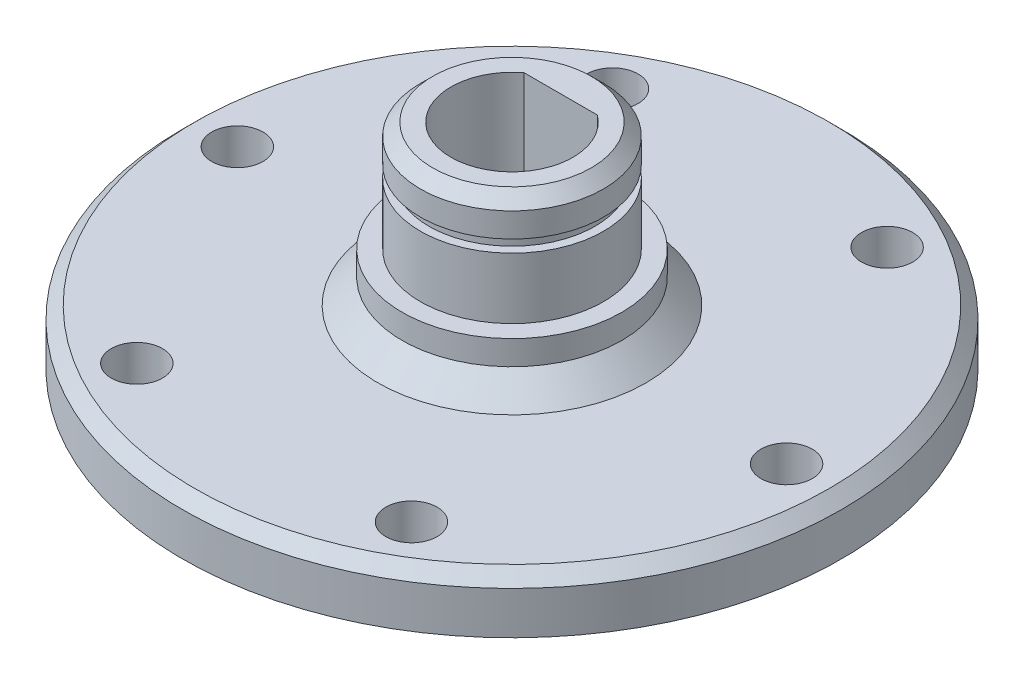
ISO-10303-21;
HEADER;
FILE_DESCRIPTION(('STEP AP214'),'2;1');
FILE_NAME('part.step','',(''),(''),'','','');
FILE_SCHEMA(('AUTOMOTIVE_DESIGN { 1 0 10303 214 1 1 1 1 }'));
ENDSEC;
DATA;
#1=APPLICATION_CONTEXT('core data for automotive mechanical design processes');
#2=APPLICATION_PROTOCOL_DEFINITION('international standard','automotive_design',2000,#1);
#3=PRODUCT_CONTEXT('',#1,'mechanical');
#4=PRODUCT('Part','Part','',(#3));
#5=PRODUCT_RELATED_PRODUCT_CATEGORY('part','',(#4));
#6=PRODUCT_DEFINITION_FORMATION('','',#4);
#7=PRODUCT_DEFINITION_CONTEXT('part definition',#1,'design');
#8=PRODUCT_DEFINITION('design','',#6,#7);
#9=PRODUCT_DEFINITION_SHAPE('','',#8);
#10=(LENGTH_UNIT() NAMED_UNIT(*) SI_UNIT(.MILLI.,.METRE.));
#11=(NAMED_UNIT(*) PLANE_ANGLE_UNIT() SI_UNIT($,.RADIAN.));
#12=(NAMED_UNIT(*) SI_UNIT($,.STERADIAN.) SOLID_ANGLE_UNIT());
#13=UNCERTAINTY_MEASURE_WITH_UNIT(LENGTH_MEASURE(1.E-05),#10,'distance_accuracy_value','');
#14=(GEOMETRIC_REPRESENTATION_CONTEXT(3) GLOBAL_UNCERTAINTY_ASSIGNED_CONTEXT((#13)) GLOBAL_UNIT_ASSIGNED_CONTEXT((#10,
#11,#12)) REPRESENTATION_CONTEXT('',''));
#15=CARTESIAN_POINT('',(0.,0.,0.));
#16=DIRECTION('',(0.,0.,1.));
#17=DIRECTION('',(1.,0.,0.));
#18=AXIS2_PLACEMENT_3D('',#15,#16,#17);
#19=CARTESIAN_POINT('',(7.5,19.,0.));
#20=DIRECTION('',(0.,-1.,0.));
#21=DIRECTION('',(1.,0.,0.));
#22=AXIS2_PLACEMENT_3D('',#19,#20,#21);
#23=PLANE('',#22);
#24=CARTESIAN_POINT('',(0.,19.,0.));
#25=DIRECTION('',(0.,-1.,0.));
#26=DIRECTION('',(1.,0.,0.));
#27=AXIS2_PLACEMENT_3D('',#24,#25,#26);
#28=CIRCLE('',#27,6.50000000000001);
#29=CARTESIAN_POINT('',(6.50000000000001,19.,0.));
#30=VERTEX_POINT('',#29);
#31=EDGE_CURVE('E50',#30,#30,#28,.F.);
#32=ORIENTED_EDGE('',*,*,#31,.T.);
#33=EDGE_LOOP('',(#32));
#34=FACE_BOUND('',#33,.T.);
#35=DIRECTION('',(-1.,0.,0.));
#36=VECTOR('',#35,1.);
#37=CARTESIAN_POINT('',(-3.,19.,-4.));
#38=LINE('',#37,#36);
#39=CARTESIAN_POINT('',(3.,19.,-4.));
#40=VERTEX_POINT('',#39);
#41=CARTESIAN_POINT('',(-3.,19.,-4.));
#42=VERTEX_POINT('',#41);
#43=EDGE_CURVE('E78',#40,#42,#38,.T.);
#44=ORIENTED_EDGE('',*,*,#43,.F.);
#45=CARTESIAN_POINT('',(0.,19.,0.));
#46=DIRECTION('',(0.,1.,0.));
#47=DIRECTION('',(-1.,0.,0.));
#48=AXIS2_PLACEMENT_3D('',#45,#46,#47);
#49=CIRCLE('',#48,5.);
#50=EDGE_CURVE('E57',#42,#40,#49,.T.);
#51=ORIENTED_EDGE('',*,*,#50,.F.);
#52=EDGE_LOOP('',(#44,#51));
#53=FACE_BOUND('',#52,.T.);
#54=ADVANCED_FACE('F41',(#34,#53),#23,.F.);
#55=CARTESIAN_POINT('',(10.,0.,0.));
#56=DIRECTION('',(0.,1.,0.));
#57=DIRECTION('',(-1.,0.,0.));
#58=AXIS2_PLACEMENT_3D('',#55,#56,#57);
#59=PLANE('',#58);
#60=DIRECTION('',(-1.,0.,0.));
#61=VECTOR('',#60,1.);
#62=CARTESIAN_POINT('',(-3.,0.,-4.));
#63=LINE('',#62,#61);
#64=CARTESIAN_POINT('',(3.,0.,-4.));
#65=VERTEX_POINT('',#64);
#66=CARTESIAN_POINT('',(-3.,0.,-4.));
#67=VERTEX_POINT('',#66);
#68=EDGE_CURVE('E91',#65,#67,#63,.T.);
#69=ORIENTED_EDGE('',*,*,#68,.T.);
#70=CARTESIAN_POINT('',(0.,0.,0.));
#71=DIRECTION('',(0.,1.,0.));
#72=DIRECTION('',(-1.,0.,0.));
#73=AXIS2_PLACEMENT_3D('',#70,#71,#72);
#74=CIRCLE('',#73,5.);
#75=EDGE_CURVE('E62',#67,#65,#74,.T.);
#76=ORIENTED_EDGE('',*,*,#75,.T.);
#77=EDGE_LOOP('',(#69,#76));
#78=FACE_BOUND('',#77,.T.);
#79=CARTESIAN_POINT('',(0.,0.,0.));
#80=DIRECTION('',(0.,1.,0.));
#81=DIRECTION('',(-1.,0.,0.));
#82=AXIS2_PLACEMENT_3D('',#79,#80,#81);
#83=CIRCLE('',#82,10.);
#84=CARTESIAN_POINT('',(-10.,0.,0.));
#85=VERTEX_POINT('',#84);
#86=EDGE_CURVE('E127',#85,#85,#83,.T.);
#87=ORIENTED_EDGE('',*,*,#86,.F.);
#88=EDGE_LOOP('',(#87));
#89=FACE_BOUND('',#88,.T.);
#90=ADVANCED_FACE('F161',(#78,#89),#59,.F.);
#91=CARTESIAN_POINT('',(0.,19.,0.));
#92=DIRECTION('',(0.,1.,0.));
#93=DIRECTION('',(-1.,0.,0.));
#94=AXIS2_PLACEMENT_3D('',#91,#92,#93);
#95=CYLINDRICAL_SURFACE('',#94,10.);
#96=CARTESIAN_POINT('',(0.,1.5,0.));
#97=DIRECTION('',(0.,1.,0.));
#98=DIRECTION('',(-1.,0.,0.));
#99=AXIS2_PLACEMENT_3D('',#96,#97,#98);
#100=CIRCLE('',#99,10.);
#101=CARTESIAN_POINT('',(-10.,1.5,0.));
#102=VERTEX_POINT('',#101);
#103=EDGE_CURVE('E123',#102,#102,#100,.T.);
#104=ORIENTED_EDGE('',*,*,#103,.F.);
#105=EDGE_LOOP('',(#104));
#106=FACE_BOUND('',#105,.T.);
#107=ORIENTED_EDGE('',*,*,#86,.T.);
#108=EDGE_LOOP('',(#107));
#109=FACE_BOUND('',#108,.T.);
#110=ADVANCED_FACE('F166',(#106,#109),#95,.T.);
#111=CARTESIAN_POINT('',(10.,1.5,0.));
#112=DIRECTION('',(0.,1.,0.));
#113=DIRECTION('',(-1.,0.,0.));
#114=AXIS2_PLACEMENT_3D('',#111,#112,#113);
#115=PLANE('',#114);
#116=CARTESIAN_POINT('',(-11.25,1.5,-19.4855715851499));
#117=DIRECTION('',(0.,1.,0.));
#118=DIRECTION('',(-1.,0.,0.));
#119=AXIS2_PLACEMENT_3D('',#116,#117,#118);
#120=CIRCLE('',#119,2.1);
#121=CARTESIAN_POINT('',(-13.35,1.5,-19.4855715851499));
#122=VERTEX_POINT('',#121);
#123=EDGE_CURVE('E432',#122,#122,#120,.T.);
#124=ORIENTED_EDGE('',*,*,#123,.T.);
#125=EDGE_LOOP('',(#124));
#126=FACE_BOUND('',#125,.T.);
#127=CARTESIAN_POINT('',(11.25,1.5,-19.4855715851499));
#128=DIRECTION('',(0.,1.,0.));
#129=DIRECTION('',(-1.,0.,0.));
#130=AXIS2_PLACEMENT_3D('',#127,#128,#129);
#131=CIRCLE('',#130,2.1);
#132=CARTESIAN_POINT('',(9.15,1.5,-19.4855715851499));
#133=VERTEX_POINT('',#132);
#134=EDGE_CURVE('E422',#133,#133,#131,.T.);
#135=ORIENTED_EDGE('',*,*,#134,.T.);
#136=EDGE_LOOP('',(#135));
#137=FACE_BOUND('',#136,.T.);
#138=CARTESIAN_POINT('',(22.5,1.5,0.));
#139=DIRECTION('',(0.,1.,0.));
#140=DIRECTION('',(-1.,0.,0.));
#141=AXIS2_PLACEMENT_3D('',#138,#139,#140);
#142=CIRCLE('',#141,2.1);
#143=CARTESIAN_POINT('',(20.4,1.5,0.));
#144=VERTEX_POINT('',#143);
#145=EDGE_CURVE('E430',#144,#144,#142,.T.);
#146=ORIENTED_EDGE('',*,*,#145,.T.);
#147=EDGE_LOOP('',(#146));
#148=FACE_BOUND('',#147,.T.);
#149=CARTESIAN_POINT('',(11.25,1.5,19.4855715851499));
#150=DIRECTION('',(0.,1.,0.));
#151=DIRECTION('',(-1.,0.,0.));
#152=AXIS2_PLACEMENT_3D('',#149,#150,#151);
#153=CIRCLE('',#152,2.1);
#154=CARTESIAN_POINT('',(9.15,1.5,19.4855715851499));
#155=VERTEX_POINT('',#154);
#156=EDGE_CURVE('E443',#155,#155,#153,.T.);
#157=ORIENTED_EDGE('',*,*,#156,.T.);
#158=EDGE_LOOP('',(#157));
#159=FACE_BOUND('',#158,.T.);
#160=CARTESIAN_POINT('',(-11.25,1.5,19.4855715851499));
#161=DIRECTION('',(0.,1.,0.));
#162=DIRECTION('',(-1.,0.,0.));
#163=AXIS2_PLACEMENT_3D('',#160,#161,#162);
#164=CIRCLE('',#163,2.1);
#165=CARTESIAN_POINT('',(-13.35,1.5,19.4855715851499));
#166=VERTEX_POINT('',#165);
#167=EDGE_CURVE('E451',#166,#166,#164,.T.);
#168=ORIENTED_EDGE('',*,*,#167,.T.);
#169=EDGE_LOOP('',(#168));
#170=FACE_BOUND('',#169,.T.);
#171=CARTESIAN_POINT('',(-22.5,1.5,0.));
#172=DIRECTION('',(0.,1.,0.));
#173=DIRECTION('',(-1.,0.,0.));
#174=AXIS2_PLACEMENT_3D('',#171,#172,#173);
#175=CIRCLE('',#174,2.1);
#176=CARTESIAN_POINT('',(-24.6,1.5,0.));
#177=VERTEX_POINT('',#176);
#178=EDGE_CURVE('E84',#177,#177,#175,.T.);
#179=ORIENTED_EDGE('',*,*,#178,.T.);
#180=EDGE_LOOP('',(#179));
#181=FACE_BOUND('',#180,.T.);
#182=CARTESIAN_POINT('',(0.,1.5,0.));
#183=DIRECTION('',(0.,1.,0.));
#184=DIRECTION('',(-1.,0.,0.));
#185=AXIS2_PLACEMENT_3D('',#182,#183,#184);
#186=CIRCLE('',#185,27.);
#187=CARTESIAN_POINT('',(-27.,1.5,0.));
#188=VERTEX_POINT('',#187);
#189=EDGE_CURVE('E119',#188,#188,#186,.T.);
#190=ORIENTED_EDGE('',*,*,#189,.F.);
#191=EDGE_LOOP('',(#190));
#192=FACE_BOUND('',#191,.T.);
#193=ORIENTED_EDGE('',*,*,#103,.T.);
#194=EDGE_LOOP('',(#193));
#195=FACE_BOUND('',#194,.T.);
#196=ADVANCED_FACE('F211',(#126,#137,#148,#159,#170,#181,#192,#195),#115,.F.);
#197=CARTESIAN_POINT('',(0.,19.,0.));
#198=DIRECTION('',(0.,1.,0.));
#199=DIRECTION('',(-1.,0.,0.));
#200=AXIS2_PLACEMENT_3D('',#197,#198,#199);
#201=CYLINDRICAL_SURFACE('',#200,27.);
#202=CARTESIAN_POINT('',(0.,5.,0.));
#203=DIRECTION('',(0.,-1.,0.));
#204=DIRECTION('',(1.,0.,0.));
#205=AXIS2_PLACEMENT_3D('',#202,#203,#204);
#206=CIRCLE('',#205,27.);
#207=CARTESIAN_POINT('',(27.,5.,0.));
#208=VERTEX_POINT('',#207);
#209=EDGE_CURVE('E143',#208,#208,#206,.T.);
#210=ORIENTED_EDGE('',*,*,#209,.T.);
#211=EDGE_LOOP('',(#210));
#212=FACE_BOUND('',#211,.T.);
#213=ORIENTED_EDGE('',*,*,#189,.T.);
#214=EDGE_LOOP('',(#213));
#215=FACE_BOUND('',#214,.T.);
#216=ADVANCED_FACE('F207',(#212,#215),#201,.T.);
#217=CARTESIAN_POINT('',(27.,6.,0.));
#218=DIRECTION('',(0.,-1.,0.));
#219=DIRECTION('',(1.,0.,0.));
#220=AXIS2_PLACEMENT_3D('',#217,#218,#219);
#221=PLANE('',#220);
#222=CARTESIAN_POINT('',(0.,6.,0.));
#223=DIRECTION('',(0.,-1.,0.));
#224=DIRECTION('',(1.,0.,0.));
#225=AXIS2_PLACEMENT_3D('',#222,#223,#224);
#226=CIRCLE('',#225,26.);
#227=CARTESIAN_POINT('',(26.,6.,0.));
#228=VERTEX_POINT('',#227);
#229=EDGE_CURVE('E139',#228,#228,#226,.F.);
#230=ORIENTED_EDGE('',*,*,#229,.T.);
#231=EDGE_LOOP('',(#230));
#232=FACE_BOUND('',#231,.T.);
#233=CARTESIAN_POINT('',(0.,6.,0.));
#234=DIRECTION('',(0.,-1.,0.));
#235=DIRECTION('',(1.,0.,0.));
#236=AXIS2_PLACEMENT_3D('',#233,#234,#235);
#237=CIRCLE('',#236,11.);
#238=CARTESIAN_POINT('',(11.,6.,0.));
#239=VERTEX_POINT('',#238);
#240=EDGE_CURVE('E135',#239,#239,#237,.T.);
#241=ORIENTED_EDGE('',*,*,#240,.T.);
#242=EDGE_LOOP('',(#241));
#243=FACE_BOUND('',#242,.T.);
#244=CARTESIAN_POINT('',(-11.25,6.,-19.4855715851499));
#245=DIRECTION('',(0.,1.,0.));
#246=DIRECTION('',(0.,0.,1.));
#247=AXIS2_PLACEMENT_3D('',#244,#245,#246);
#248=CIRCLE('',#247,2.1);
#249=CARTESIAN_POINT('',(-11.25,6.,-17.3855715851499));
#250=VERTEX_POINT('',#249);
#251=EDGE_CURVE('E483',#250,#250,#248,.T.);
#252=ORIENTED_EDGE('',*,*,#251,.F.);
#253=EDGE_LOOP('',(#252));
#254=FACE_BOUND('',#253,.T.);
#255=CARTESIAN_POINT('',(11.25,6.,-19.4855715851499));
#256=DIRECTION('',(0.,1.,0.));
#257=DIRECTION('',(0.,0.,1.));
#258=AXIS2_PLACEMENT_3D('',#255,#256,#257);
#259=CIRCLE('',#258,2.1);
#260=CARTESIAN_POINT('',(11.25,6.,-17.3855715851499));
#261=VERTEX_POINT('',#260);
#262=EDGE_CURVE('E419',#261,#261,#259,.T.);
#263=ORIENTED_EDGE('',*,*,#262,.F.);
#264=EDGE_LOOP('',(#263));
#265=FACE_BOUND('',#264,.T.);
#266=CARTESIAN_POINT('',(22.5,6.,0.));
#267=DIRECTION('',(0.,1.,0.));
#268=DIRECTION('',(0.,0.,1.));
#269=AXIS2_PLACEMENT_3D('',#266,#267,#268);
#270=CIRCLE('',#269,2.1);
#271=CARTESIAN_POINT('',(22.5,6.,2.09999999999999));
#272=VERTEX_POINT('',#271);
#273=EDGE_CURVE('E425',#272,#272,#270,.T.);
#274=ORIENTED_EDGE('',*,*,#273,.F.);
#275=EDGE_LOOP('',(#274));
#276=FACE_BOUND('',#275,.T.);
#277=CARTESIAN_POINT('',(11.25,6.,19.4855715851499));
#278=DIRECTION('',(0.,1.,0.));
#279=DIRECTION('',(0.,0.,1.));
#280=AXIS2_PLACEMENT_3D('',#277,#278,#279);
#281=CIRCLE('',#280,2.1);
#282=CARTESIAN_POINT('',(11.25,6.,21.5855715851499));
#283=VERTEX_POINT('',#282);
#284=EDGE_CURVE('E439',#283,#283,#281,.T.);
#285=ORIENTED_EDGE('',*,*,#284,.F.);
#286=EDGE_LOOP('',(#285));
#287=FACE_BOUND('',#286,.T.);
#288=CARTESIAN_POINT('',(-11.25,6.,19.4855715851499));
#289=DIRECTION('',(0.,1.,0.));
#290=DIRECTION('',(0.,0.,1.));
#291=AXIS2_PLACEMENT_3D('',#288,#289,#290);
#292=CIRCLE('',#291,2.1);
#293=CARTESIAN_POINT('',(-11.25,6.,21.5855715851499));
#294=VERTEX_POINT('',#293);
#295=EDGE_CURVE('E447',#294,#294,#292,.T.);
#296=ORIENTED_EDGE('',*,*,#295,.F.);
#297=EDGE_LOOP('',(#296));
#298=FACE_BOUND('',#297,.T.);
#299=CARTESIAN_POINT('',(-22.5,6.,0.));
#300=DIRECTION('',(0.,1.,0.));
#301=DIRECTION('',(0.,0.,1.));
#302=AXIS2_PLACEMENT_3D('',#299,#300,#301);
#303=CIRCLE('',#302,2.1);
#304=CARTESIAN_POINT('',(-22.5,6.,2.1));
#305=VERTEX_POINT('',#304);
#306=EDGE_CURVE('E88',#305,#305,#303,.T.);
#307=ORIENTED_EDGE('',*,*,#306,.F.);
#308=EDGE_LOOP('',(#307));
#309=FACE_BOUND('',#308,.T.);
#310=ADVANCED_FACE('F188',(#232,#243,#254,#265,#276,#287,#298,#309),#221,.F.);
#311=CARTESIAN_POINT('',(0.,19.,0.));
#312=DIRECTION('',(0.,1.,0.));
#313=DIRECTION('',(-1.,0.,0.));
#314=AXIS2_PLACEMENT_3D('',#311,#312,#313);
#315=CYLINDRICAL_SURFACE('',#314,9.);
#316=CARTESIAN_POINT('',(0.,8.,0.));
#317=DIRECTION('',(0.,-1.,0.));
#318=DIRECTION('',(1.,0.,0.));
#319=AXIS2_PLACEMENT_3D('',#316,#317,#318);
#320=CIRCLE('',#319,9.);
#321=CARTESIAN_POINT('',(9.,8.,0.));
#322=VERTEX_POINT('',#321);
#323=EDGE_CURVE('E130',#322,#322,#320,.F.);
#324=ORIENTED_EDGE('',*,*,#323,.T.);
#325=EDGE_LOOP('',(#324));
#326=FACE_BOUND('',#325,.T.);
#327=CARTESIAN_POINT('',(0.,10.,0.));
#328=DIRECTION('',(0.,1.,0.));
#329=DIRECTION('',(-1.,0.,0.));
#330=AXIS2_PLACEMENT_3D('',#327,#328,#329);
#331=CIRCLE('',#330,9.);
#332=CARTESIAN_POINT('',(-9.,10.,0.));
#333=VERTEX_POINT('',#332);
#334=EDGE_CURVE('E115',#333,#333,#331,.T.);
#335=ORIENTED_EDGE('',*,*,#334,.F.);
#336=EDGE_LOOP('',(#335));
#337=FACE_BOUND('',#336,.T.);
#338=ADVANCED_FACE('F184',(#326,#337),#315,.T.);
#339=CARTESIAN_POINT('',(9.,10.,0.));
#340=DIRECTION('',(0.,-1.,0.));
#341=DIRECTION('',(1.,0.,0.));
#342=AXIS2_PLACEMENT_3D('',#339,#340,#341);
#343=PLANE('',#342);
#344=CARTESIAN_POINT('',(0.,10.,0.));
#345=DIRECTION('',(0.,1.,0.));
#346=DIRECTION('',(-1.,0.,0.));
#347=AXIS2_PLACEMENT_3D('',#344,#345,#346);
#348=CIRCLE('',#347,7.5);
#349=CARTESIAN_POINT('',(-7.5,10.,0.));
#350=VERTEX_POINT('',#349);
#351=EDGE_CURVE('E111',#350,#350,#348,.T.);
#352=ORIENTED_EDGE('',*,*,#351,.F.);
#353=EDGE_LOOP('',(#352));
#354=FACE_BOUND('',#353,.T.);
#355=ORIENTED_EDGE('',*,*,#334,.T.);
#356=EDGE_LOOP('',(#355));
#357=FACE_BOUND('',#356,.T.);
#358=ADVANCED_FACE('F187',(#354,#357),#343,.F.);
#359=CARTESIAN_POINT('',(0.,19.,0.));
#360=DIRECTION('',(0.,1.,0.));
#361=DIRECTION('',(-1.,0.,0.));
#362=AXIS2_PLACEMENT_3D('',#359,#360,#361);
#363=CYLINDRICAL_SURFACE('',#362,7.5);
#364=CARTESIAN_POINT('',(0.,15.,0.));
#365=DIRECTION('',(0.,1.,0.));
#366=DIRECTION('',(-1.,0.,0.));
#367=AXIS2_PLACEMENT_3D('',#364,#365,#366);
#368=CIRCLE('',#367,7.5);
#369=CARTESIAN_POINT('',(-7.5,15.,0.));
#370=VERTEX_POINT('',#369);
#371=EDGE_CURVE('E107',#370,#370,#368,.T.);
#372=ORIENTED_EDGE('',*,*,#371,.F.);
#373=EDGE_LOOP('',(#372));
#374=FACE_BOUND('',#373,.T.);
#375=ORIENTED_EDGE('',*,*,#351,.T.);
#376=EDGE_LOOP('',(#375));
#377=FACE_BOUND('',#376,.T.);
#378=ADVANCED_FACE('F193',(#374,#377),#363,.T.);
#379=CARTESIAN_POINT('',(7.5,15.,0.));
#380=DIRECTION('',(0.,-1.,0.));
#381=DIRECTION('',(1.,0.,0.));
#382=AXIS2_PLACEMENT_3D('',#379,#380,#381);
#383=PLANE('',#382);
#384=CARTESIAN_POINT('',(0.,15.,0.));
#385=DIRECTION('',(0.,1.,0.));
#386=DIRECTION('',(-1.,0.,0.));
#387=AXIS2_PLACEMENT_3D('',#384,#385,#386);
#388=CIRCLE('',#387,6.8);
#389=CARTESIAN_POINT('',(-6.8,15.,0.));
#390=VERTEX_POINT('',#389);
#391=EDGE_CURVE('E103',#390,#390,#388,.T.);
#392=ORIENTED_EDGE('',*,*,#391,.F.);
#393=EDGE_LOOP('',(#392));
#394=FACE_BOUND('',#393,.T.);
#395=ORIENTED_EDGE('',*,*,#371,.T.);
#396=EDGE_LOOP('',(#395));
#397=FACE_BOUND('',#396,.T.);
#398=ADVANCED_FACE('F199',(#394,#397),#383,.F.);
#399=CARTESIAN_POINT('',(0.,19.,0.));
#400=DIRECTION('',(0.,1.,0.));
#401=DIRECTION('',(-1.,0.,0.));
#402=AXIS2_PLACEMENT_3D('',#399,#400,#401);
#403=CYLINDRICAL_SURFACE('',#402,6.8);
#404=CARTESIAN_POINT('',(0.,16.,0.));
#405=DIRECTION('',(0.,1.,0.));
#406=DIRECTION('',(-1.,0.,0.));
#407=AXIS2_PLACEMENT_3D('',#404,#405,#406);
#408=CIRCLE('',#407,6.8);
#409=CARTESIAN_POINT('',(-6.8,16.,0.));
#410=VERTEX_POINT('',#409);
#411=EDGE_CURVE('E99',#410,#410,#408,.T.);
#412=ORIENTED_EDGE('',*,*,#411,.F.);
#413=EDGE_LOOP('',(#412));
#414=FACE_BOUND('',#413,.T.);
#415=ORIENTED_EDGE('',*,*,#391,.T.);
#416=EDGE_LOOP('',(#415));
#417=FACE_BOUND('',#416,.T.);
#418=ADVANCED_FACE('F367',(#414,#417),#403,.T.);
#419=CARTESIAN_POINT('',(7.5,16.,0.));
#420=DIRECTION('',(0.,1.,0.));
#421=DIRECTION('',(-1.,0.,0.));
#422=AXIS2_PLACEMENT_3D('',#419,#420,#421);
#423=PLANE('',#422);
#424=CARTESIAN_POINT('',(0.,16.,0.));
#425=DIRECTION('',(0.,1.,0.));
#426=DIRECTION('',(-1.,0.,0.));
#427=AXIS2_PLACEMENT_3D('',#424,#425,#426);
#428=CIRCLE('',#427,7.5);
#429=CARTESIAN_POINT('',(-7.5,16.,0.));
#430=VERTEX_POINT('',#429);
#431=EDGE_CURVE('E74',#430,#430,#428,.T.);
#432=ORIENTED_EDGE('',*,*,#431,.F.);
#433=EDGE_LOOP('',(#432));
#434=FACE_BOUND('',#433,.T.);
#435=ORIENTED_EDGE('',*,*,#411,.T.);
#436=EDGE_LOOP('',(#435));
#437=FACE_BOUND('',#436,.T.);
#438=ADVANCED_FACE('F278',(#434,#437),#423,.F.);
#439=CARTESIAN_POINT('',(0.,19.,0.));
#440=DIRECTION('',(0.,1.,0.));
#441=DIRECTION('',(-1.,0.,0.));
#442=AXIS2_PLACEMENT_3D('',#439,#440,#441);
#443=CYLINDRICAL_SURFACE('',#442,7.5);
#444=CARTESIAN_POINT('',(0.,18.,0.));
#445=DIRECTION('',(0.,-1.,0.));
#446=DIRECTION('',(1.,0.,0.));
#447=AXIS2_PLACEMENT_3D('',#444,#445,#446);
#448=CIRCLE('',#447,7.5);
#449=CARTESIAN_POINT('',(7.5,18.,0.));
#450=VERTEX_POINT('',#449);
#451=EDGE_CURVE('E11',#450,#450,#448,.T.);
#452=ORIENTED_EDGE('',*,*,#451,.T.);
#453=EDGE_LOOP('',(#452));
#454=FACE_BOUND('',#453,.T.);
#455=ORIENTED_EDGE('',*,*,#431,.T.);
#456=EDGE_LOOP('',(#455));
#457=FACE_BOUND('',#456,.T.);
#458=ADVANCED_FACE('F286',(#454,#457),#443,.T.);
#459=CARTESIAN_POINT('',(0.,0.,0.));
#460=DIRECTION('',(0.,1.,0.));
#461=DIRECTION('',(-1.,0.,0.));
#462=AXIS2_PLACEMENT_3D('',#459,#460,#461);
#463=CYLINDRICAL_SURFACE('',#462,5.);
#464=ORIENTED_EDGE('',*,*,#50,.T.);
#465=DIRECTION('',(0.,1.,0.));
#466=VECTOR('',#465,1.);
#467=CARTESIAN_POINT('',(3.,0.,-4.));
#468=LINE('',#467,#466);
#469=EDGE_CURVE('E75',#65,#40,#468,.T.);
#470=ORIENTED_EDGE('',*,*,#469,.F.);
#471=ORIENTED_EDGE('',*,*,#75,.F.);
#472=DIRECTION('',(0.,1.,0.));
#473=VECTOR('',#472,1.);
#474=CARTESIAN_POINT('',(-3.,0.,-4.));
#475=LINE('',#474,#473);
#476=EDGE_CURVE('E67',#67,#42,#475,.T.);
#477=ORIENTED_EDGE('',*,*,#476,.T.);
#478=EDGE_LOOP('',(#464,#470,#471,#477));
#479=FACE_BOUND('',#478,.T.);
#480=ADVANCED_FACE('F69',(#479),#463,.F.);
#481=CARTESIAN_POINT('',(-3.,0.,-4.));
#482=DIRECTION('',(0.,0.,-1.));
#483=DIRECTION('',(-1.,0.,0.));
#484=AXIS2_PLACEMENT_3D('',#481,#482,#483);
#485=PLANE('',#484);
#486=ORIENTED_EDGE('',*,*,#43,.T.);
#487=ORIENTED_EDGE('',*,*,#476,.F.);
#488=ORIENTED_EDGE('',*,*,#68,.F.);
#489=ORIENTED_EDGE('',*,*,#469,.T.);
#490=EDGE_LOOP('',(#486,#487,#488,#489));
#491=FACE_BOUND('',#490,.T.);
#492=ADVANCED_FACE('F79',(#491),#485,.F.);
#493=CARTESIAN_POINT('',(-22.5,6.,0.));
#494=DIRECTION('',(0.,1.,0.));
#495=DIRECTION('',(0.,0.,1.));
#496=AXIS2_PLACEMENT_3D('',#493,#494,#495);
#497=CYLINDRICAL_SURFACE('',#496,2.1);
#498=ORIENTED_EDGE('',*,*,#306,.T.);
#499=EDGE_LOOP('',(#498));
#500=FACE_BOUND('',#499,.T.);
#501=ORIENTED_EDGE('',*,*,#178,.F.);
#502=EDGE_LOOP('',(#501));
#503=FACE_BOUND('',#502,.T.);
#504=ADVANCED_FACE('F296',(#500,#503),#497,.F.);
#505=CARTESIAN_POINT('',(-11.25,6.,19.4855715851499));
#506=DIRECTION('',(0.,1.,0.));
#507=DIRECTION('',(0.,0.,1.));
#508=AXIS2_PLACEMENT_3D('',#505,#506,#507);
#509=CYLINDRICAL_SURFACE('',#508,2.1);
#510=ORIENTED_EDGE('',*,*,#295,.T.);
#511=EDGE_LOOP('',(#510));
#512=FACE_BOUND('',#511,.T.);
#513=ORIENTED_EDGE('',*,*,#167,.F.);
#514=EDGE_LOOP('',(#513));
#515=FACE_BOUND('',#514,.T.);
#516=ADVANCED_FACE('F306',(#512,#515),#509,.F.);
#517=CARTESIAN_POINT('',(11.25,6.,19.4855715851499));
#518=DIRECTION('',(0.,1.,0.));
#519=DIRECTION('',(0.,0.,1.));
#520=AXIS2_PLACEMENT_3D('',#517,#518,#519);
#521=CYLINDRICAL_SURFACE('',#520,2.1);
#522=ORIENTED_EDGE('',*,*,#284,.T.);
#523=EDGE_LOOP('',(#522));
#524=FACE_BOUND('',#523,.T.);
#525=ORIENTED_EDGE('',*,*,#156,.F.);
#526=EDGE_LOOP('',(#525));
#527=FACE_BOUND('',#526,.T.);
#528=ADVANCED_FACE('F313',(#524,#527),#521,.F.);
#529=CARTESIAN_POINT('',(22.5,6.,0.));
#530=DIRECTION('',(0.,1.,0.));
#531=DIRECTION('',(0.,0.,1.));
#532=AXIS2_PLACEMENT_3D('',#529,#530,#531);
#533=CYLINDRICAL_SURFACE('',#532,2.1);
#534=ORIENTED_EDGE('',*,*,#273,.T.);
#535=EDGE_LOOP('',(#534));
#536=FACE_BOUND('',#535,.T.);
#537=ORIENTED_EDGE('',*,*,#145,.F.);
#538=EDGE_LOOP('',(#537));
#539=FACE_BOUND('',#538,.T.);
#540=ADVANCED_FACE('F321',(#536,#539),#533,.F.);
#541=CARTESIAN_POINT('',(11.25,6.,-19.4855715851499));
#542=DIRECTION('',(0.,1.,0.));
#543=DIRECTION('',(0.,0.,1.));
#544=AXIS2_PLACEMENT_3D('',#541,#542,#543);
#545=CYLINDRICAL_SURFACE('',#544,2.1);
#546=ORIENTED_EDGE('',*,*,#262,.T.);
#547=EDGE_LOOP('',(#546));
#548=FACE_BOUND('',#547,.T.);
#549=ORIENTED_EDGE('',*,*,#134,.F.);
#550=EDGE_LOOP('',(#549));
#551=FACE_BOUND('',#550,.T.);
#552=ADVANCED_FACE('F177',(#548,#551),#545,.F.);
#553=CARTESIAN_POINT('',(-11.25,6.,-19.4855715851499));
#554=DIRECTION('',(0.,1.,0.));
#555=DIRECTION('',(0.,0.,1.));
#556=AXIS2_PLACEMENT_3D('',#553,#554,#555);
#557=CYLINDRICAL_SURFACE('',#556,2.1);
#558=ORIENTED_EDGE('',*,*,#251,.T.);
#559=EDGE_LOOP('',(#558));
#560=FACE_BOUND('',#559,.T.);
#561=ORIENTED_EDGE('',*,*,#123,.F.);
#562=EDGE_LOOP('',(#561));
#563=FACE_BOUND('',#562,.T.);
#564=ADVANCED_FACE('F172',(#560,#563),#557,.F.);
#565=CARTESIAN_POINT('',(0.,8.,0.));
#566=DIRECTION('',(0.,-1.,0.));
#567=DIRECTION('',(1.,0.,0.));
#568=AXIS2_PLACEMENT_3D('',#565,#566,#567);
#569=CONICAL_SURFACE('',#568,9.,0.785398163397446);
#570=ORIENTED_EDGE('',*,*,#240,.F.);
#571=EDGE_LOOP('',(#570));
#572=FACE_BOUND('',#571,.T.);
#573=ORIENTED_EDGE('',*,*,#323,.F.);
#574=EDGE_LOOP('',(#573));
#575=FACE_BOUND('',#574,.T.);
#576=ADVANCED_FACE('F157',(#572,#575),#569,.T.);
#577=CARTESIAN_POINT('',(0.,6.,0.));
#578=DIRECTION('',(0.,-1.,0.));
#579=DIRECTION('',(1.,0.,0.));
#580=AXIS2_PLACEMENT_3D('',#577,#578,#579);
#581=CONICAL_SURFACE('',#580,26.,0.785398163397447);
#582=ORIENTED_EDGE('',*,*,#209,.F.);
#583=EDGE_LOOP('',(#582));
#584=FACE_BOUND('',#583,.T.);
#585=ORIENTED_EDGE('',*,*,#229,.F.);
#586=EDGE_LOOP('',(#585));
#587=FACE_BOUND('',#586,.T.);
#588=ADVANCED_FACE('F152',(#584,#587),#581,.T.);
#589=CARTESIAN_POINT('',(0.,19.,0.));
#590=DIRECTION('',(0.,-1.,0.));
#591=DIRECTION('',(1.,0.,0.));
#592=AXIS2_PLACEMENT_3D('',#589,#590,#591);
#593=CONICAL_SURFACE('',#592,6.50000000000001,0.785398163397449);
#594=ORIENTED_EDGE('',*,*,#451,.F.);
#595=EDGE_LOOP('',(#594));
#596=FACE_BOUND('',#595,.T.);
#597=ORIENTED_EDGE('',*,*,#31,.F.);
#598=EDGE_LOOP('',(#597));
#599=FACE_BOUND('',#598,.T.);
#600=ADVANCED_FACE('F43',(#596,#599),#593,.T.);
#601=CLOSED_SHELL('',(#54,#90,#110,#196,#216,#310,#338,#358,#378,#398,#418,#438,#458,#480,#492,
#504,#516,#528,#540,#552,#564,#576,#588,#600));
#602=MANIFOLD_SOLID_BREP('B2',#601);
#603=ADVANCED_BREP_SHAPE_REPRESENTATION('',(#18,#602),#14);
#604=SHAPE_DEFINITION_REPRESENTATION(#9,#603);
ENDSEC;
END-ISO-10303-21;
